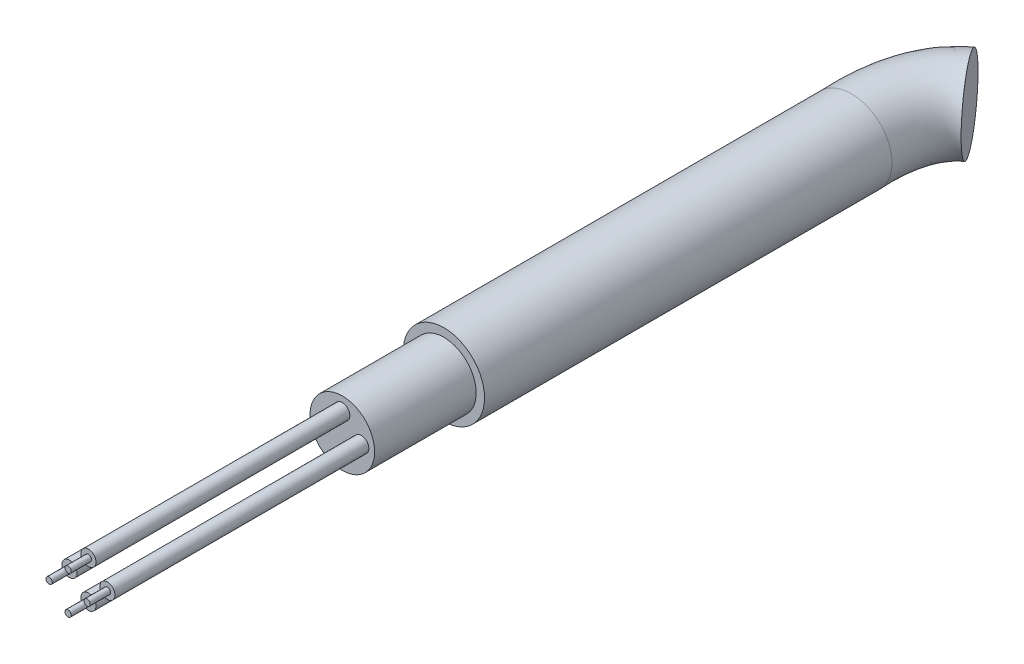
ISO-10303-21;
HEADER;
FILE_DESCRIPTION(('STEP AP214'),'2;1');
FILE_NAME('part.step','',(''),(''),'','','');
FILE_SCHEMA(('AUTOMOTIVE_DESIGN { 1 0 10303 214 1 1 1 1 }'));
ENDSEC;
DATA;
#1=APPLICATION_CONTEXT('core data for automotive mechanical design processes');
#2=APPLICATION_PROTOCOL_DEFINITION('international standard','automotive_design',2000,#1);
#3=PRODUCT_CONTEXT('',#1,'mechanical');
#4=PRODUCT('Part','Part','',(#3));
#5=PRODUCT_RELATED_PRODUCT_CATEGORY('part','',(#4));
#6=PRODUCT_DEFINITION_FORMATION('','',#4);
#7=PRODUCT_DEFINITION_CONTEXT('part definition',#1,'design');
#8=PRODUCT_DEFINITION('design','',#6,#7);
#9=PRODUCT_DEFINITION_SHAPE('','',#8);
#10=(LENGTH_UNIT() NAMED_UNIT(*) SI_UNIT(.MILLI.,.METRE.));
#11=(NAMED_UNIT(*) PLANE_ANGLE_UNIT() SI_UNIT($,.RADIAN.));
#12=(NAMED_UNIT(*) SI_UNIT($,.STERADIAN.) SOLID_ANGLE_UNIT());
#13=UNCERTAINTY_MEASURE_WITH_UNIT(LENGTH_MEASURE(1.E-05),#10,'distance_accuracy_value','');
#14=(GEOMETRIC_REPRESENTATION_CONTEXT(3) GLOBAL_UNCERTAINTY_ASSIGNED_CONTEXT((#13)) GLOBAL_UNIT_ASSIGNED_CONTEXT((#10,
#11,#12)) REPRESENTATION_CONTEXT('',''));
#15=CARTESIAN_POINT('',(0.,0.,0.));
#16=DIRECTION('',(0.,0.,1.));
#17=DIRECTION('',(1.,0.,0.));
#18=AXIS2_PLACEMENT_3D('',#15,#16,#17);
#19=CARTESIAN_POINT('',(0.,0.,0.));
#20=DIRECTION('',(0.,0.,1.));
#21=DIRECTION('',(1.,0.,0.));
#22=AXIS2_PLACEMENT_3D('',#19,#20,#21);
#23=PLANE('',#22);
#24=CARTESIAN_POINT('',(0.,1.86896236105194,0.));
#25=DIRECTION('',(0.,0.,1.));
#26=DIRECTION('',(1.,0.,0.));
#27=AXIS2_PLACEMENT_3D('',#24,#25,#26);
#28=CIRCLE('',#27,0.745292526683294);
#29=CARTESIAN_POINT('',(0.745292526683294,1.86896236105194,0.));
#30=VERTEX_POINT('',#29);
#31=EDGE_CURVE('E74',#30,#30,#28,.T.);
#32=ORIENTED_EDGE('',*,*,#31,.F.);
#33=EDGE_LOOP('',(#32));
#34=FACE_BOUND('',#33,.T.);
#35=CARTESIAN_POINT('',(1.86896236105199,0.,0.));
#36=DIRECTION('',(0.,0.,1.));
#37=DIRECTION('',(1.,0.,0.));
#38=AXIS2_PLACEMENT_3D('',#35,#36,#37);
#39=CIRCLE('',#38,0.745292526683335);
#40=CARTESIAN_POINT('',(2.61425488773533,0.,0.));
#41=VERTEX_POINT('',#40);
#42=EDGE_CURVE('E114',#41,#41,#39,.T.);
#43=ORIENTED_EDGE('',*,*,#42,.F.);
#44=EDGE_LOOP('',(#43));
#45=FACE_BOUND('',#44,.T.);
#46=CARTESIAN_POINT('',(1.05551564692403E-13,-1.86896236105194,0.));
#47=DIRECTION('',(0.,0.,1.));
#48=DIRECTION('',(1.,0.,0.));
#49=AXIS2_PLACEMENT_3D('',#46,#47,#48);
#50=CIRCLE('',#49,0.745292526683408);
#51=CARTESIAN_POINT('',(0.745292526683513,-1.86896236105194,0.));
#52=VERTEX_POINT('',#51);
#53=EDGE_CURVE('E118',#52,#52,#50,.T.);
#54=ORIENTED_EDGE('',*,*,#53,.F.);
#55=EDGE_LOOP('',(#54));
#56=FACE_BOUND('',#55,.T.);
#57=CARTESIAN_POINT('',(-1.86896236105189,0.,0.));
#58=DIRECTION('',(0.,0.,1.));
#59=DIRECTION('',(1.,0.,0.));
#60=AXIS2_PLACEMENT_3D('',#57,#58,#59);
#61=CIRCLE('',#60,0.745292526683379);
#62=CARTESIAN_POINT('',(-1.12366983436851,0.,0.));
#63=VERTEX_POINT('',#62);
#64=EDGE_CURVE('E122',#63,#63,#61,.T.);
#65=ORIENTED_EDGE('',*,*,#64,.F.);
#66=EDGE_LOOP('',(#65));
#67=FACE_BOUND('',#66,.T.);
#68=CARTESIAN_POINT('',(0.,0.,0.));
#69=DIRECTION('',(0.,0.,1.));
#70=DIRECTION('',(1.,0.,0.));
#71=AXIS2_PLACEMENT_3D('',#68,#69,#70);
#72=CIRCLE('',#71,3.17823133983708);
#73=CARTESIAN_POINT('',(3.17823133983708,0.,0.));
#74=VERTEX_POINT('',#73);
#75=EDGE_CURVE('E125',#74,#74,#72,.T.);
#76=ORIENTED_EDGE('',*,*,#75,.T.);
#77=EDGE_LOOP('',(#76));
#78=FACE_BOUND('',#77,.T.);
#79=ADVANCED_FACE('F36',(#34,#45,#56,#67,#78),#23,.T.);
#80=CARTESIAN_POINT('',(0.,1.86896236105194,25.));
#81=DIRECTION('',(0.,0.,-1.));
#82=DIRECTION('',(-1.,0.,0.));
#83=AXIS2_PLACEMENT_3D('',#80,#81,#82);
#84=CYLINDRICAL_SURFACE('',#83,0.745292526683294);
#85=CARTESIAN_POINT('',(0.,1.86896236105194,25.));
#86=DIRECTION('',(0.,0.,1.));
#87=DIRECTION('',(1.,0.,0.));
#88=AXIS2_PLACEMENT_3D('',#85,#86,#87);
#89=CIRCLE('',#88,0.745292526683294);
#90=CARTESIAN_POINT('',(0.745292526683294,1.86896236105194,25.));
#91=VERTEX_POINT('',#90);
#92=EDGE_CURVE('E159',#91,#91,#89,.T.);
#93=ORIENTED_EDGE('',*,*,#92,.F.);
#94=EDGE_LOOP('',(#93));
#95=FACE_BOUND('',#94,.T.);
#96=ORIENTED_EDGE('',*,*,#31,.T.);
#97=EDGE_LOOP('',(#96));
#98=FACE_BOUND('',#97,.T.);
#99=ADVANCED_FACE('F101',(#95,#98),#84,.T.);
#100=CARTESIAN_POINT('',(0.,1.86896236105194,25.));
#101=DIRECTION('',(0.,0.,1.));
#102=DIRECTION('',(1.,0.,0.));
#103=AXIS2_PLACEMENT_3D('',#100,#101,#102);
#104=PLANE('',#103);
#105=CARTESIAN_POINT('',(0.,1.86896236105194,25.));
#106=DIRECTION('',(0.,0.,1.));
#107=DIRECTION('',(1.,0.,0.));
#108=AXIS2_PLACEMENT_3D('',#105,#106,#107);
#109=CIRCLE('',#108,0.309058366374965);
#110=CARTESIAN_POINT('',(0.309058366374965,1.86896236105194,25.));
#111=VERTEX_POINT('',#110);
#112=EDGE_CURVE('E62',#111,#111,#109,.T.);
#113=ORIENTED_EDGE('',*,*,#112,.F.);
#114=EDGE_LOOP('',(#113));
#115=FACE_BOUND('',#114,.T.);
#116=ORIENTED_EDGE('',*,*,#92,.T.);
#117=EDGE_LOOP('',(#116));
#118=FACE_BOUND('',#117,.T.);
#119=ADVANCED_FACE('F106',(#115,#118),#104,.T.);
#120=CARTESIAN_POINT('',(1.86896236105199,0.,25.));
#121=DIRECTION('',(0.,0.,-1.));
#122=DIRECTION('',(-1.,0.,0.));
#123=AXIS2_PLACEMENT_3D('',#120,#121,#122);
#124=CYLINDRICAL_SURFACE('',#123,0.745292526683335);
#125=CARTESIAN_POINT('',(1.86896236105199,0.,25.));
#126=DIRECTION('',(0.,0.,1.));
#127=DIRECTION('',(1.,0.,0.));
#128=AXIS2_PLACEMENT_3D('',#125,#126,#127);
#129=CIRCLE('',#128,0.745292526683335);
#130=CARTESIAN_POINT('',(2.61425488773533,0.,25.));
#131=VERTEX_POINT('',#130);
#132=EDGE_CURVE('E156',#131,#131,#129,.T.);
#133=ORIENTED_EDGE('',*,*,#132,.F.);
#134=EDGE_LOOP('',(#133));
#135=FACE_BOUND('',#134,.T.);
#136=ORIENTED_EDGE('',*,*,#42,.T.);
#137=EDGE_LOOP('',(#136));
#138=FACE_BOUND('',#137,.T.);
#139=ADVANCED_FACE('F232',(#135,#138),#124,.T.);
#140=CARTESIAN_POINT('',(1.86896236105199,0.,25.));
#141=DIRECTION('',(0.,0.,1.));
#142=DIRECTION('',(1.,0.,0.));
#143=AXIS2_PLACEMENT_3D('',#140,#141,#142);
#144=PLANE('',#143);
#145=CARTESIAN_POINT('',(1.86896236105199,0.,25.));
#146=DIRECTION('',(0.,0.,1.));
#147=DIRECTION('',(1.,0.,0.));
#148=AXIS2_PLACEMENT_3D('',#145,#146,#147);
#149=CIRCLE('',#148,0.309058366375007);
#150=CARTESIAN_POINT('',(2.178020727427,0.,25.));
#151=VERTEX_POINT('',#150);
#152=EDGE_CURVE('E65',#151,#151,#149,.T.);
#153=ORIENTED_EDGE('',*,*,#152,.F.);
#154=EDGE_LOOP('',(#153));
#155=FACE_BOUND('',#154,.T.);
#156=ORIENTED_EDGE('',*,*,#132,.T.);
#157=EDGE_LOOP('',(#156));
#158=FACE_BOUND('',#157,.T.);
#159=ADVANCED_FACE('F228',(#155,#158),#144,.T.);
#160=CARTESIAN_POINT('',(1.05551564692403E-13,-1.86896236105194,25.));
#161=DIRECTION('',(0.,0.,-1.));
#162=DIRECTION('',(-1.,0.,0.));
#163=AXIS2_PLACEMENT_3D('',#160,#161,#162);
#164=CYLINDRICAL_SURFACE('',#163,0.745292526683408);
#165=CARTESIAN_POINT('',(1.05551564692403E-13,-1.86896236105194,25.));
#166=DIRECTION('',(0.,0.,1.));
#167=DIRECTION('',(1.,0.,0.));
#168=AXIS2_PLACEMENT_3D('',#165,#166,#167);
#169=CIRCLE('',#168,0.745292526683408);
#170=CARTESIAN_POINT('',(0.745292526683513,-1.86896236105194,25.));
#171=VERTEX_POINT('',#170);
#172=EDGE_CURVE('E152',#171,#171,#169,.T.);
#173=ORIENTED_EDGE('',*,*,#172,.F.);
#174=EDGE_LOOP('',(#173));
#175=FACE_BOUND('',#174,.T.);
#176=ORIENTED_EDGE('',*,*,#53,.T.);
#177=EDGE_LOOP('',(#176));
#178=FACE_BOUND('',#177,.T.);
#179=ADVANCED_FACE('F224',(#175,#178),#164,.T.);
#180=CARTESIAN_POINT('',(1.05551564692403E-13,-1.86896236105194,25.));
#181=DIRECTION('',(0.,0.,1.));
#182=DIRECTION('',(1.,0.,0.));
#183=AXIS2_PLACEMENT_3D('',#180,#181,#182);
#184=PLANE('',#183);
#185=CARTESIAN_POINT('',(1.05551564692403E-13,-1.86896236105194,25.));
#186=DIRECTION('',(0.,0.,1.));
#187=DIRECTION('',(1.,0.,0.));
#188=AXIS2_PLACEMENT_3D('',#185,#186,#187);
#189=CIRCLE('',#188,0.309058366375079);
#190=CARTESIAN_POINT('',(0.309058366375184,-1.86896236105194,25.));
#191=VERTEX_POINT('',#190);
#192=EDGE_CURVE('E45',#191,#191,#189,.T.);
#193=ORIENTED_EDGE('',*,*,#192,.F.);
#194=EDGE_LOOP('',(#193));
#195=FACE_BOUND('',#194,.T.);
#196=ORIENTED_EDGE('',*,*,#172,.T.);
#197=EDGE_LOOP('',(#196));
#198=FACE_BOUND('',#197,.T.);
#199=ADVANCED_FACE('F220',(#195,#198),#184,.T.);
#200=CARTESIAN_POINT('',(-1.86896236105189,0.,25.));
#201=DIRECTION('',(0.,0.,-1.));
#202=DIRECTION('',(-1.,0.,0.));
#203=AXIS2_PLACEMENT_3D('',#200,#201,#202);
#204=CYLINDRICAL_SURFACE('',#203,0.745292526683379);
#205=CARTESIAN_POINT('',(-1.86896236105189,0.,25.));
#206=DIRECTION('',(0.,0.,1.));
#207=DIRECTION('',(1.,0.,0.));
#208=AXIS2_PLACEMENT_3D('',#205,#206,#207);
#209=CIRCLE('',#208,0.745292526683379);
#210=CARTESIAN_POINT('',(-1.12366983436851,0.,25.));
#211=VERTEX_POINT('',#210);
#212=EDGE_CURVE('E148',#211,#211,#209,.T.);
#213=ORIENTED_EDGE('',*,*,#212,.F.);
#214=EDGE_LOOP('',(#213));
#215=FACE_BOUND('',#214,.T.);
#216=ORIENTED_EDGE('',*,*,#64,.T.);
#217=EDGE_LOOP('',(#216));
#218=FACE_BOUND('',#217,.T.);
#219=ADVANCED_FACE('F216',(#215,#218),#204,.T.);
#220=CARTESIAN_POINT('',(-1.86896236105189,0.,25.));
#221=DIRECTION('',(0.,0.,1.));
#222=DIRECTION('',(1.,0.,0.));
#223=AXIS2_PLACEMENT_3D('',#220,#221,#222);
#224=PLANE('',#223);
#225=CARTESIAN_POINT('',(-1.86896236105189,0.,25.));
#226=DIRECTION('',(0.,0.,1.));
#227=DIRECTION('',(1.,0.,0.));
#228=AXIS2_PLACEMENT_3D('',#225,#226,#227);
#229=CIRCLE('',#228,0.30905836637505);
#230=CARTESIAN_POINT('',(-1.55990399467684,0.,25.));
#231=VERTEX_POINT('',#230);
#232=EDGE_CURVE('E12',#231,#231,#229,.T.);
#233=ORIENTED_EDGE('',*,*,#232,.F.);
#234=EDGE_LOOP('',(#233));
#235=FACE_BOUND('',#234,.T.);
#236=ORIENTED_EDGE('',*,*,#212,.T.);
#237=EDGE_LOOP('',(#236));
#238=FACE_BOUND('',#237,.T.);
#239=ADVANCED_FACE('F212',(#235,#238),#224,.T.);
#240=CARTESIAN_POINT('',(0.,1.86896236105194,27.));
#241=DIRECTION('',(0.,0.,-1.));
#242=DIRECTION('',(-1.,0.,0.));
#243=AXIS2_PLACEMENT_3D('',#240,#241,#242);
#244=CYLINDRICAL_SURFACE('',#243,0.309058366374965);
#245=CARTESIAN_POINT('',(0.,1.86896236105194,27.));
#246=DIRECTION('',(0.,0.,1.));
#247=DIRECTION('',(1.,0.,0.));
#248=AXIS2_PLACEMENT_3D('',#245,#246,#247);
#249=CIRCLE('',#248,0.309058366374965);
#250=CARTESIAN_POINT('',(0.309058366374965,1.86896236105194,27.));
#251=VERTEX_POINT('',#250);
#252=EDGE_CURVE('E143',#251,#251,#249,.T.);
#253=ORIENTED_EDGE('',*,*,#252,.F.);
#254=EDGE_LOOP('',(#253));
#255=FACE_BOUND('',#254,.T.);
#256=ORIENTED_EDGE('',*,*,#112,.T.);
#257=EDGE_LOOP('',(#256));
#258=FACE_BOUND('',#257,.T.);
#259=ADVANCED_FACE('F208',(#255,#258),#244,.T.);
#260=CARTESIAN_POINT('',(0.,1.86896236105194,27.));
#261=DIRECTION('',(0.,0.,1.));
#262=DIRECTION('',(1.,0.,0.));
#263=AXIS2_PLACEMENT_3D('',#260,#261,#262);
#264=PLANE('',#263);
#265=ORIENTED_EDGE('',*,*,#252,.T.);
#266=EDGE_LOOP('',(#265));
#267=FACE_BOUND('',#266,.T.);
#268=ADVANCED_FACE('F204',(#267),#264,.T.);
#269=CARTESIAN_POINT('',(1.86896236105199,0.,27.));
#270=DIRECTION('',(0.,0.,-1.));
#271=DIRECTION('',(-1.,0.,0.));
#272=AXIS2_PLACEMENT_3D('',#269,#270,#271);
#273=CYLINDRICAL_SURFACE('',#272,0.309058366375007);
#274=CARTESIAN_POINT('',(1.86896236105199,0.,27.));
#275=DIRECTION('',(0.,0.,1.));
#276=DIRECTION('',(1.,0.,0.));
#277=AXIS2_PLACEMENT_3D('',#274,#275,#276);
#278=CIRCLE('',#277,0.309058366375007);
#279=CARTESIAN_POINT('',(2.178020727427,0.,27.));
#280=VERTEX_POINT('',#279);
#281=EDGE_CURVE('E138',#280,#280,#278,.T.);
#282=ORIENTED_EDGE('',*,*,#281,.F.);
#283=EDGE_LOOP('',(#282));
#284=FACE_BOUND('',#283,.T.);
#285=ORIENTED_EDGE('',*,*,#152,.T.);
#286=EDGE_LOOP('',(#285));
#287=FACE_BOUND('',#286,.T.);
#288=ADVANCED_FACE('F200',(#284,#287),#273,.T.);
#289=CARTESIAN_POINT('',(1.86896236105199,0.,27.));
#290=DIRECTION('',(0.,0.,1.));
#291=DIRECTION('',(1.,0.,0.));
#292=AXIS2_PLACEMENT_3D('',#289,#290,#291);
#293=PLANE('',#292);
#294=ORIENTED_EDGE('',*,*,#281,.T.);
#295=EDGE_LOOP('',(#294));
#296=FACE_BOUND('',#295,.T.);
#297=ADVANCED_FACE('F196',(#296),#293,.T.);
#298=CARTESIAN_POINT('',(1.05551564692403E-13,-1.86896236105194,27.));
#299=DIRECTION('',(0.,0.,-1.));
#300=DIRECTION('',(-1.,0.,0.));
#301=AXIS2_PLACEMENT_3D('',#298,#299,#300);
#302=CYLINDRICAL_SURFACE('',#301,0.309058366375079);
#303=CARTESIAN_POINT('',(1.05551564692403E-13,-1.86896236105194,27.));
#304=DIRECTION('',(0.,0.,1.));
#305=DIRECTION('',(1.,0.,0.));
#306=AXIS2_PLACEMENT_3D('',#303,#304,#305);
#307=CIRCLE('',#306,0.309058366375079);
#308=CARTESIAN_POINT('',(0.309058366375184,-1.86896236105194,27.));
#309=VERTEX_POINT('',#308);
#310=EDGE_CURVE('E134',#309,#309,#307,.T.);
#311=ORIENTED_EDGE('',*,*,#310,.F.);
#312=EDGE_LOOP('',(#311));
#313=FACE_BOUND('',#312,.T.);
#314=ORIENTED_EDGE('',*,*,#192,.T.);
#315=EDGE_LOOP('',(#314));
#316=FACE_BOUND('',#315,.T.);
#317=ADVANCED_FACE('F192',(#313,#316),#302,.T.);
#318=CARTESIAN_POINT('',(1.05551564692403E-13,-1.86896236105194,27.));
#319=DIRECTION('',(0.,0.,1.));
#320=DIRECTION('',(1.,0.,0.));
#321=AXIS2_PLACEMENT_3D('',#318,#319,#320);
#322=PLANE('',#321);
#323=ORIENTED_EDGE('',*,*,#310,.T.);
#324=EDGE_LOOP('',(#323));
#325=FACE_BOUND('',#324,.T.);
#326=ADVANCED_FACE('F188',(#325),#322,.T.);
#327=CARTESIAN_POINT('',(-1.86896236105189,0.,27.));
#328=DIRECTION('',(0.,0.,-1.));
#329=DIRECTION('',(-1.,0.,0.));
#330=AXIS2_PLACEMENT_3D('',#327,#328,#329);
#331=CYLINDRICAL_SURFACE('',#330,0.30905836637505);
#332=CARTESIAN_POINT('',(-1.86896236105189,0.,27.));
#333=DIRECTION('',(0.,0.,1.));
#334=DIRECTION('',(1.,0.,0.));
#335=AXIS2_PLACEMENT_3D('',#332,#333,#334);
#336=CIRCLE('',#335,0.30905836637505);
#337=CARTESIAN_POINT('',(-1.55990399467684,0.,27.));
#338=VERTEX_POINT('',#337);
#339=EDGE_CURVE('E132',#338,#338,#336,.T.);
#340=ORIENTED_EDGE('',*,*,#339,.F.);
#341=EDGE_LOOP('',(#340));
#342=FACE_BOUND('',#341,.T.);
#343=ORIENTED_EDGE('',*,*,#232,.T.);
#344=EDGE_LOOP('',(#343));
#345=FACE_BOUND('',#344,.T.);
#346=ADVANCED_FACE('F184',(#342,#345),#331,.T.);
#347=CARTESIAN_POINT('',(-1.86896236105189,0.,27.));
#348=DIRECTION('',(0.,0.,1.));
#349=DIRECTION('',(1.,0.,0.));
#350=AXIS2_PLACEMENT_3D('',#347,#348,#349);
#351=PLANE('',#350);
#352=ORIENTED_EDGE('',*,*,#339,.T.);
#353=EDGE_LOOP('',(#352));
#354=FACE_BOUND('',#353,.T.);
#355=ADVANCED_FACE('F178',(#354),#351,.T.);
#356=CARTESIAN_POINT('',(0.585566423483881,0.,-10.));
#357=DIRECTION('',(0.,0.,1.));
#358=DIRECTION('',(1.,0.,0.));
#359=AXIS2_PLACEMENT_3D('',#356,#357,#358);
#360=PLANE('',#359);
#361=CARTESIAN_POINT('',(0.,0.,-10.));
#362=DIRECTION('',(0.,0.,1.));
#363=DIRECTION('',(1.,0.,0.));
#364=AXIS2_PLACEMENT_3D('',#361,#362,#363);
#365=CIRCLE('',#364,3.17823133983708);
#366=CARTESIAN_POINT('',(3.17823133983708,0.,-10.));
#367=VERTEX_POINT('',#366);
#368=EDGE_CURVE('E127',#367,#367,#365,.T.);
#369=ORIENTED_EDGE('',*,*,#368,.F.);
#370=EDGE_LOOP('',(#369));
#371=FACE_BOUND('',#370,.T.);
#372=CARTESIAN_POINT('',(0.,0.,-10.));
#373=DIRECTION('',(0.,0.,1.));
#374=DIRECTION('',(1.,0.,0.));
#375=AXIS2_PLACEMENT_3D('',#372,#373,#374);
#376=CIRCLE('',#375,4.);
#377=CARTESIAN_POINT('',(4.,0.,-10.));
#378=VERTEX_POINT('',#377);
#379=EDGE_CURVE('E40',#378,#378,#376,.T.);
#380=ORIENTED_EDGE('',*,*,#379,.T.);
#381=EDGE_LOOP('',(#380));
#382=FACE_BOUND('',#381,.T.);
#383=ADVANCED_FACE('F172',(#371,#382),#360,.T.);
#384=CARTESIAN_POINT('',(0.,0.,-10.));
#385=DIRECTION('',(0.,0.,1.));
#386=DIRECTION('',(1.,0.,0.));
#387=AXIS2_PLACEMENT_3D('',#384,#385,#386);
#388=CYLINDRICAL_SURFACE('',#387,3.17823133983708);
#389=ORIENTED_EDGE('',*,*,#368,.T.);
#390=EDGE_LOOP('',(#389));
#391=FACE_BOUND('',#390,.T.);
#392=ORIENTED_EDGE('',*,*,#75,.F.);
#393=EDGE_LOOP('',(#392));
#394=FACE_BOUND('',#393,.T.);
#395=ADVANCED_FACE('F168',(#391,#394),#388,.T.);
#396=CARTESIAN_POINT('',(2.8340954734297,0.,-58.922304352964));
#397=DIRECTION('',(-0.803450903354103,0.,0.595371015333696));
#398=DIRECTION('',(0.595371015333696,0.,0.803450903354103));
#399=AXIS2_PLACEMENT_3D('',#396,#397,#398);
#400=PLANE('',#399);
#401=CARTESIAN_POINT('',(2.8340954734297,0.,-58.922304352964));
#402=DIRECTION('',(-0.803450903354103,0.,0.595371015333696));
#403=DIRECTION('',(0.595371015333696,0.,0.803450903354103));
#404=AXIS2_PLACEMENT_3D('',#401,#402,#403);
#405=CIRCLE('',#404,4.);
#406=CARTESIAN_POINT('',(5.21557953476449,0.,-55.7085007395476));
#407=VERTEX_POINT('',#406);
#408=EDGE_CURVE('E58',#407,#407,#405,.T.);
#409=ORIENTED_EDGE('',*,*,#408,.F.);
#410=EDGE_LOOP('',(#409));
#411=FACE_BOUND('',#410,.T.);
#412=ADVANCED_FACE('F38',(#411),#400,.F.);
#413=CARTESIAN_POINT('',(4.00672619687716,0.,-50.0083802094525));
#414=CARTESIAN_POINT('',(4.00207838189957,0.,-50.0856464339236));
#415=CARTESIAN_POINT('',(3.99706454064748,0.,-50.1689868795729));
#416=CARTESIAN_POINT('',(3.9777024969775,0.,-50.4909137125681));
#417=CARTESIAN_POINT('',(3.96932640783645,0.,-50.6916710846166));
#418=CARTESIAN_POINT('',(3.95791583194575,0.,-51.1212011860934));
#419=CARTESIAN_POINT('',(3.95616590553623,0.,-51.3285891028583));
#420=CARTESIAN_POINT('',(3.9621090793307,0.,-51.9281191479228));
#421=CARTESIAN_POINT('',(3.98105355248449,0.,-52.2976014010061));
#422=CARTESIAN_POINT('',(4.07556151478469,0.,-53.3119250515326));
#423=CARTESIAN_POINT('',(4.18961013673211,0.,-53.8608560669799));
#424=CARTESIAN_POINT('',(4.45916773460456,0.,-54.7094777860373));
#425=CARTESIAN_POINT('',(4.61139176730067,0.,-55.0074491485355));
#426=CARTESIAN_POINT('',(4.90473740837825,0.,-55.4402902188833));
#427=CARTESIAN_POINT('',(5.04325241417801,0.,-55.580803360092));
#428=CARTESIAN_POINT('',(5.21557953476449,0.,-55.7085007395476));
#429=CARTESIAN_POINT('',(4.00672619687716,8.,-50.0083802094525));
#430=CARTESIAN_POINT('',(4.00207838189957,8.,-50.0856464339236));
#431=CARTESIAN_POINT('',(3.99706454064748,8.,-50.1689868795729));
#432=CARTESIAN_POINT('',(3.9777024969775,8.,-50.4909137125681));
#433=CARTESIAN_POINT('',(3.96932640783645,8.,-50.6916710846166));
#434=CARTESIAN_POINT('',(3.95791583194575,8.,-51.1212011860934));
#435=CARTESIAN_POINT('',(3.95616590553623,8.,-51.3285891028583));
#436=CARTESIAN_POINT('',(3.9621090793307,8.,-51.9281191479228));
#437=CARTESIAN_POINT('',(3.98105355248449,8.,-52.2976014010061));
#438=CARTESIAN_POINT('',(4.07556151478469,8.,-53.3119250515326));
#439=CARTESIAN_POINT('',(4.18961013673211,8.,-53.8608560669799));
#440=CARTESIAN_POINT('',(4.45916773460456,8.,-54.7094777860373));
#441=CARTESIAN_POINT('',(4.61139176730067,8.,-55.0074491485355));
#442=CARTESIAN_POINT('',(4.90473740837825,8.,-55.4402902188833));
#443=CARTESIAN_POINT('',(5.04325241417801,8.,-55.580803360092));
#444=CARTESIAN_POINT('',(5.21557953476449,8.,-55.7085007395476));
#445=CARTESIAN_POINT('',(-3.97883930701196,8.,-49.5280224437235));
#446=CARTESIAN_POINT('',(-3.98348712198954,8.,-49.6052886681946));
#447=CARTESIAN_POINT('',(-3.9877705469975,8.,-49.6764825428556));
#448=CARTESIAN_POINT('',(-4.0104354979797,8.,-50.0533355887569));
#449=CARTESIAN_POINT('',(-4.02537730610587,8.,-50.3860598741112));
#450=CARTESIAN_POINT('',(-4.04173773935027,8.,-51.0019182543195));
#451=CARTESIAN_POINT('',(-4.04444668779672,8.,-51.3064437527262));
#452=CARTESIAN_POINT('',(-4.03548659702524,8.,-52.2103114761502));
#453=CARTESIAN_POINT('',(-4.00678904162212,8.,-52.7999710993499));
#454=CARTESIAN_POINT('',(-3.84525136171539,8.,-54.5337031695196));
#455=CARTESIAN_POINT('',(-3.63777681347431,8.,-55.6443160904133));
#456=CARTESIAN_POINT('',(-2.96263592020341,8.,-57.7697958223358));
#457=CARTESIAN_POINT('',(-2.49168463194451,8.,-58.7863819745058));
#458=CARTESIAN_POINT('',(-1.23702748034564,8.,-60.6376695118462));
#459=CARTESIAN_POINT('',(-0.450715014423362,8.,-61.4667274636364));
#460=CARTESIAN_POINT('',(0.452611412094917,8.,-62.1361079663804));
#461=CARTESIAN_POINT('',(-3.97883930701196,0.,-49.5280224437235));
#462=CARTESIAN_POINT('',(-3.98348712198954,0.,-49.6052886681946));
#463=CARTESIAN_POINT('',(-3.9877705469975,0.,-49.6764825428556));
#464=CARTESIAN_POINT('',(-4.0104354979797,0.,-50.0533355887569));
#465=CARTESIAN_POINT('',(-4.02537730610587,0.,-50.3860598741112));
#466=CARTESIAN_POINT('',(-4.04173773935027,0.,-51.0019182543195));
#467=CARTESIAN_POINT('',(-4.04444668779673,0.,-51.3064437527262));
#468=CARTESIAN_POINT('',(-4.03548659702524,0.,-52.2103114761502));
#469=CARTESIAN_POINT('',(-4.00678904162213,0.,-52.7999710993499));
#470=CARTESIAN_POINT('',(-3.84525136171539,0.,-54.5337031695196));
#471=CARTESIAN_POINT('',(-3.63777681347431,0.,-55.6443160904133));
#472=CARTESIAN_POINT('',(-2.96263592020341,0.,-57.7697958223358));
#473=CARTESIAN_POINT('',(-2.49168463194451,0.,-58.7863819745058));
#474=CARTESIAN_POINT('',(-1.23702748034564,0.,-60.6376695118462));
#475=CARTESIAN_POINT('',(-0.450715014423145,0.,-61.4667274636364));
#476=CARTESIAN_POINT('',(0.452611412094917,0.,-62.1361079663804));
#477=CARTESIAN_POINT('',(-3.97883930701196,-8.,-49.5280224437235));
#478=CARTESIAN_POINT('',(-3.98348712198954,-8.,-49.6052886681946));
#479=CARTESIAN_POINT('',(-3.9877705469975,-8.,-49.6764825428556));
#480=CARTESIAN_POINT('',(-4.0104354979797,-8.,-50.0533355887569));
#481=CARTESIAN_POINT('',(-4.02537730610587,-8.,-50.3860598741112));
#482=CARTESIAN_POINT('',(-4.04173773935027,-8.,-51.0019182543195));
#483=CARTESIAN_POINT('',(-4.04444668779673,-8.,-51.3064437527262));
#484=CARTESIAN_POINT('',(-4.03548659702524,-8.,-52.2103114761502));
#485=CARTESIAN_POINT('',(-4.00678904162213,-8.,-52.7999710993499));
#486=CARTESIAN_POINT('',(-3.84525136171539,-8.,-54.5337031695196));
#487=CARTESIAN_POINT('',(-3.63777681347432,-8.,-55.6443160904133));
#488=CARTESIAN_POINT('',(-2.96263592020341,-8.,-57.7697958223358));
#489=CARTESIAN_POINT('',(-2.49168463194451,-8.,-58.7863819745058));
#490=CARTESIAN_POINT('',(-1.23702748034564,-8.,-60.6376695118462));
#491=CARTESIAN_POINT('',(-0.450715014422928,-8.,-61.4667274636364));
#492=CARTESIAN_POINT('',(0.452611412094916,-8.,-62.1361079663804));
#493=CARTESIAN_POINT('',(4.00672619687716,-8.,-50.0083802094525));
#494=CARTESIAN_POINT('',(4.00207838189957,-8.,-50.0856464339236));
#495=CARTESIAN_POINT('',(3.99706454064748,-8.,-50.1689868795729));
#496=CARTESIAN_POINT('',(3.9777024969775,-8.,-50.4909137125681));
#497=CARTESIAN_POINT('',(3.96932640783645,-8.,-50.6916710846166));
#498=CARTESIAN_POINT('',(3.95791583194575,-8.,-51.1212011860934));
#499=CARTESIAN_POINT('',(3.95616590553623,-8.,-51.3285891028583));
#500=CARTESIAN_POINT('',(3.9621090793307,-8.,-51.9281191479228));
#501=CARTESIAN_POINT('',(3.98105355248449,-8.,-52.2976014010061));
#502=CARTESIAN_POINT('',(4.07556151478469,-8.,-53.3119250515326));
#503=CARTESIAN_POINT('',(4.18961013673211,-8.,-53.8608560669799));
#504=CARTESIAN_POINT('',(4.45916773460456,-8.,-54.7094777860373));
#505=CARTESIAN_POINT('',(4.61139176730067,-8.,-55.0074491485355));
#506=CARTESIAN_POINT('',(4.90473740837825,-8.,-55.4402902188833));
#507=CARTESIAN_POINT('',(5.04325241417801,-8.,-55.580803360092));
#508=CARTESIAN_POINT('',(5.21557953476449,-8.,-55.7085007395476));
#509=CARTESIAN_POINT('',(4.00672619687716,0.,-50.0083802094525));
#510=CARTESIAN_POINT('',(4.00207838189957,0.,-50.0856464339236));
#511=CARTESIAN_POINT('',(3.99706454064748,0.,-50.1689868795729));
#512=CARTESIAN_POINT('',(3.9777024969775,0.,-50.4909137125681));
#513=CARTESIAN_POINT('',(3.96932640783645,0.,-50.6916710846166));
#514=CARTESIAN_POINT('',(3.95791583194575,0.,-51.1212011860934));
#515=CARTESIAN_POINT('',(3.95616590553623,0.,-51.3285891028583));
#516=CARTESIAN_POINT('',(3.9621090793307,0.,-51.9281191479228));
#517=CARTESIAN_POINT('',(3.98105355248449,0.,-52.2976014010061));
#518=CARTESIAN_POINT('',(4.07556151478469,0.,-53.3119250515326));
#519=CARTESIAN_POINT('',(4.18961013673211,0.,-53.8608560669799));
#520=CARTESIAN_POINT('',(4.45916773460456,0.,-54.7094777860373));
#521=CARTESIAN_POINT('',(4.61139176730067,0.,-55.0074491485355));
#522=CARTESIAN_POINT('',(4.90473740837825,0.,-55.4402902188833));
#523=CARTESIAN_POINT('',(5.04325241417801,0.,-55.580803360092));
#524=CARTESIAN_POINT('',(5.21557953476449,0.,-55.7085007395476));
#525=(BOUNDED_SURFACE() B_SPLINE_SURFACE(3,3,((#413,#414,#415,#416,#417,#418,#419,#420,#421,
#422,#423,#424,#425,#426,#427,#428),(#429,#430,#431,#432,#433,#434,#435,#436,#437,#438,#439,
#440,#441,#442,#443,#444),(#445,#446,#447,#448,#449,#450,#451,#452,#453,#454,#455,#456,#457,
#458,#459,#460),(#461,#462,#463,#464,#465,#466,#467,#468,#469,#470,#471,#472,#473,#474,#475,
#476),(#477,#478,#479,#480,#481,#482,#483,#484,#485,#486,#487,#488,#489,#490,#491,#492),(#493,
#494,#495,#496,#497,#498,#499,#500,#501,#502,#503,#504,#505,#506,#507,#508),(#509,#510,#511,
#512,#513,#514,#515,#516,#517,#518,#519,#520,#521,#522,#523,#524)),.UNSPECIFIED.,.T.,.F.,
.F.) B_SPLINE_SURFACE_WITH_KNOTS((4,3,4),(4,2,2,2,2,2,2,4),(0.,0.5,1.),(-0.0177458401410981,0.,
0.0625,0.125,0.25,0.5,0.75,1.),
.UNSPECIFIED.) GEOMETRIC_REPRESENTATION_ITEM() RATIONAL_B_SPLINE_SURFACE(((1.,1.,1.,1.,1.,1.,1.,
1.,1.,1.,1.,1.,1.,1.,1.,1.),(0.333333333333333,0.333333333333333,0.333333333333333,
0.333333333333333,0.333333333333333,0.333333333333333,0.333333333333333,0.333333333333333,
0.333333333333333,0.333333333333333,0.333333333333333,0.333333333333333,0.333333333333333,
0.333333333333333,0.333333333333333,0.333333333333333),(0.333333333333333,0.333333333333333,
0.333333333333333,0.333333333333333,0.333333333333333,0.333333333333333,0.333333333333333,
0.333333333333333,0.333333333333333,0.333333333333333,0.333333333333333,0.333333333333333,
0.333333333333333,0.333333333333333,0.333333333333333,0.333333333333333),(1.,1.,1.,1.,1.,1.,1.,
1.,1.,1.,1.,1.,1.,1.,1.,1.),(0.333333333333333,0.333333333333333,0.333333333333333,
0.333333333333333,0.333333333333333,0.333333333333333,0.333333333333333,0.333333333333333,
0.333333333333333,0.333333333333333,0.333333333333333,0.333333333333333,0.333333333333333,
0.333333333333333,0.333333333333333,0.333333333333333),(0.333333333333333,0.333333333333333,
0.333333333333333,0.333333333333333,0.333333333333333,0.333333333333333,0.333333333333333,
0.333333333333333,0.333333333333333,0.333333333333333,0.333333333333333,0.333333333333333,
0.333333333333333,0.333333333333333,0.333333333333333,0.333333333333333),(1.,1.,1.,1.,1.,1.,1.,
1.,1.,1.,1.,1.,1.,1.,1.,1.))) REPRESENTATION_ITEM('') SURFACE());
#526=CARTESIAN_POINT('',(0.,-4.,-50.));
#527=CARTESIAN_POINT('',(-0.0171997998424996,-4.00000016046357,-49.9994832385518));
#528=CARTESIAN_POINT('',(-0.034400844136553,-3.99988918360831,-49.9989667033206));
#529=CARTESIAN_POINT('',(-0.16388914126829,-3.99821766780464,-49.9950802457596));
#530=CARTESIAN_POINT('',(-0.276160200801189,-3.99203524451447,-49.9917217813082));
#531=CARTESIAN_POINT('',(-0.499812722203374,-3.97024244676974,-49.9850540768173));
#532=CARTESIAN_POINT('',(-0.611193741664172,-3.95462764730748,-49.9817448606287));
#533=CARTESIAN_POINT('',(-0.832492748245821,-3.91402975644806,-49.9751922671484));
#534=CARTESIAN_POINT('',(-0.942407178911246,-3.88902709472763,-49.9719490424187));
#535=CARTESIAN_POINT('',(-1.15979442926671,-3.82982958440634,-49.9655563500875));
#536=CARTESIAN_POINT('',(-1.26726531634964,-3.79562771683614,-49.9624069561253));
#537=CARTESIAN_POINT('',(-1.58434695653262,-3.6797182794343,-49.9531461835285));
#538=CARTESIAN_POINT('',(-1.78922764630992,-3.58459594941063,-49.9472044363475));
#539=CARTESIAN_POINT('',(-2.18009202821372,-3.3612302305065,-49.9359382900171));
#540=CARTESIAN_POINT('',(-2.36607480428265,-3.23298523710411,-49.9306139207926));
#541=CARTESIAN_POINT('',(-2.62679803415673,-3.01871546946381,-49.9231898254224));
#542=CARTESIAN_POINT('',(-2.71070032374641,-2.9435999540102,-49.9208078483413));
#543=CARTESIAN_POINT('',(-2.87182173221029,-2.78662233958251,-49.9162453216258));
#544=CARTESIAN_POINT('',(-2.94904723049032,-2.70476682975934,-49.9140645795823));
#545=CARTESIAN_POINT('',(-3.0963648569286,-2.534793523488,-49.9099141973749));
#546=CARTESIAN_POINT('',(-3.1664534403514,-2.44667265172707,-49.9079446620867));
#547=CARTESIAN_POINT('',(-3.29896420613212,-2.26484246185766,-49.9042287384611));
#548=CARTESIAN_POINT('',(-3.36138460769301,-2.17113185311147,-49.9024824019537));
#549=CARTESIAN_POINT('',(-3.53635369155693,-1.88271803965867,-49.8975960545925));
#550=CARTESIAN_POINT('',(-3.63682745857571,-1.68048176357643,-49.8948026035926));
#551=CARTESIAN_POINT('',(-3.80233495543803,-1.26211276756243,-49.890210996355));
#552=CARTESIAN_POINT('',(-3.86736946064468,-1.04598035177509,-49.8884128183422));
#553=CARTESIAN_POINT('',(-3.9602285870426,-0.605900040178819,-49.8858476750648));
#554=CARTESIAN_POINT('',(-3.98806504823011,-0.381954654507879,-49.8850803816732));
#555=CARTESIAN_POINT('',(-4.00574949324861,0.0674247251940653,-49.8845927571744));
#556=CARTESIAN_POINT('',(-3.99559749225594,0.292858718630337,-49.884872425649));
#557=CARTESIAN_POINT('',(-3.93760518939902,0.738788127017385,-49.886472548316));
#558=CARTESIAN_POINT('',(-3.8897707193213,0.959284300721433,-49.8877928414602));
#559=CARTESIAN_POINT('',(-3.75777872548763,1.38911674876828,-49.8914462345222));
#560=CARTESIAN_POINT('',(-3.67362068883005,1.59845286548022,-49.8937793487413));
#561=CARTESIAN_POINT('',(-3.47136315030364,2.00004764712953,-49.8994087389051));
#562=CARTESIAN_POINT('',(-3.35325955038074,2.19230424648355,-49.9027051311416));
#563=CARTESIAN_POINT('',(-3.08648460297496,2.55424136479484,-49.9101883194604));
#564=CARTESIAN_POINT('',(-2.93781618276256,2.72392404315248,-49.9143750302758));
#565=CARTESIAN_POINT('',(-2.61411735096166,3.03594002104257,-49.9235444733507));
#566=CARTESIAN_POINT('',(-2.43908482085417,3.17827112061317,-49.9285272695824));
#567=CARTESIAN_POINT('',(-2.06753175207335,3.43160081965791,-49.9391740451357));
#568=CARTESIAN_POINT('',(-1.87100049145719,3.54258368525735,-49.9448383644915));
#569=CARTESIAN_POINT('',(-1.46181500717388,3.7301283997984,-49.9567141920449));
#570=CARTESIAN_POINT('',(-1.2491356540932,3.80663525949576,-49.962926555637));
#571=CARTESIAN_POINT('',(-0.814306654249145,3.92267301271335,-49.9757188565253));
#572=CARTESIAN_POINT('',(-0.592178468820724,3.96228346401322,-49.9822979703758));
#573=CARTESIAN_POINT('',(-0.263123063843658,3.99274474333043,-49.9921117648735));
#574=CARTESIAN_POINT('',(-0.157382325998497,3.99830290515929,-49.9952755343278));
#575=CARTESIAN_POINT('',(-0.0344016314612747,3.99988897128241,-49.9989666808305));
#576=CARTESIAN_POINT('',(-0.0172007037148562,3.99999991492534,-49.9994832127307));
#577=CARTESIAN_POINT('',(0.,4.,-50.));
#578=B_SPLINE_CURVE_WITH_KNOTS('',3,(#526,#527,#528,#529,#530,#531,#532,#533,#534,#535,#536,
#537,#538,#539,#540,#541,#542,#543,#544,#545,#546,#547,#548,#549,#550,#551,#552,#553,#554,#555,
#556,#557,#558,#559,#560,#561,#562,#563,#564,#565,#566,#567,#568,#569,#570,#571,#572,#573,#574,
#575,#576,#577),.UNSPECIFIED.,.F.,.F.,(4,2,2,2,2,2,2,2,2,2,2,2,2,2,2,2,2,2,2,2,2,2,2,2,2,4),(0.,
0.051625833154178,0.388644569181992,0.725821533625915,1.06370532908881,1.40184766392189,
2.07632162571496,2.75082826638094,3.08841019971239,3.42566593794721,3.76308837429776,
4.1005890233867,4.77460673899233,5.44860970740979,6.12239809209979,6.79618620761237,
7.46987006730562,8.14356343996507,8.81733817796546,9.49104841688287,10.164812821487,
10.8389147941932,11.5140881868295,12.1878023455605,12.505306139994,12.5569319731482),.UNSPECIFIED.);
#579=CARTESIAN_POINT('',(0.,-4.,-50.));
#580=VERTEX_POINT('',#579);
#581=CARTESIAN_POINT('',(0.,4.,-50.));
#582=VERTEX_POINT('',#581);
#583=EDGE_CURVE('E52',#580,#582,#578,.T.);
#584=CARTESIAN_POINT('',(0.,-4.,-50.));
#585=CARTESIAN_POINT('',(0.0171997999203268,-4.00000016046418,-50.0005167602492));
#586=CARTESIAN_POINT('',(0.0344008362816297,-3.99988918360941,-50.001033558877));
#587=CARTESIAN_POINT('',(0.163892170674326,-3.99821762935347,-50.0049240861737));
#588=CARTESIAN_POINT('',(0.276165943449349,-3.99203491416875,-50.0082973689855));
#589=CARTESIAN_POINT('',(0.499823172944169,-3.97024119895367,-50.0150172815893));
#590=CARTESIAN_POINT('',(0.611206186870388,-3.95462577331229,-50.0183638981229));
#591=CARTESIAN_POINT('',(0.832508518949557,-3.91402645353337,-50.025013240942));
#592=CARTESIAN_POINT('',(0.942424278769902,-3.88902298640371,-50.0283158604982));
#593=CARTESIAN_POINT('',(1.15981357071895,-3.82982382245345,-50.0348477959486));
#594=CARTESIAN_POINT('',(1.26728516989495,-3.79562110707689,-50.0380770538231));
#595=CARTESIAN_POINT('',(1.58437005134042,-3.6797085481409,-50.0476047758691));
#596=CARTESIAN_POINT('',(1.78925241547663,-3.58458372486507,-50.0537611863517));
#597=CARTESIAN_POINT('',(2.18011901458465,-3.36121287814578,-50.065506317432));
#598=CARTESIAN_POINT('',(2.36610233228913,-3.23296524815207,-50.0710950104755));
#599=CARTESIAN_POINT('',(2.62682920152597,-3.01868853326995,-50.078929778961));
#600=CARTESIAN_POINT('',(2.71073448566558,-2.94356869337014,-50.0814511222113));
#601=CARTESIAN_POINT('',(2.87186134874133,-2.7865817225337,-50.086292983181));
#602=CARTESIAN_POINT('',(2.94908930738027,-2.70472118120664,-50.0886136925913));
#603=CARTESIAN_POINT('',(3.09641126317025,-2.5347370783372,-50.0930407483575));
#604=CARTESIAN_POINT('',(3.16650171578572,-2.44661044154319,-50.0951469882061));
#605=CARTESIAN_POINT('',(3.29901553290485,-2.26476798901009,-50.099129078675));
#606=CARTESIAN_POINT('',(3.36143711671508,-2.17105088265328,-50.1010048757871));
#607=CARTESIAN_POINT('',(3.53640480546885,-1.8826226601645,-50.1062627434341));
#608=CARTESIAN_POINT('',(3.63687583443897,-1.68037802029046,-50.109281961056));
#609=CARTESIAN_POINT('',(3.80237578097843,-1.26199099110408,-50.114255345561));
#610=CARTESIAN_POINT('',(3.86740548831604,-1.0458489115999,-50.1162095361768));
#611=CARTESIAN_POINT('',(3.96024902797601,-0.605763877695028,-50.1189995542668));
#612=CARTESIAN_POINT('',(3.98807721251069,-0.381823965901824,-50.119835813035));
#613=CARTESIAN_POINT('',(4.00574713619122,0.0675433873013061,-50.1203668080194));
#614=CARTESIAN_POINT('',(3.99558890041879,0.292970827728947,-50.1200615449893));
#615=CARTESIAN_POINT('',(3.93758768563471,0.73887666964957,-50.118318563849));
#616=CARTESIAN_POINT('',(3.88975205887298,0.959356028063895,-50.1168810666795));
#617=CARTESIAN_POINT('',(3.75776375558093,1.38915453561665,-50.1129147236084));
#618=CARTESIAN_POINT('',(3.6736105748835,1.59847352977947,-50.1103858625562));
#619=CARTESIAN_POINT('',(3.47136687522473,2.00003966853833,-50.1043083186478));
#620=CARTESIAN_POINT('',(3.35327151169824,2.19228437099105,-50.1007594902116));
#621=CARTESIAN_POINT('',(3.08651774611225,2.55420004545534,-50.0927434409119));
#622=CARTESIAN_POINT('',(2.93786220564948,2.72387312858192,-50.0882763060369));
#623=CARTESIAN_POINT('',(2.61410829518696,3.03595530464698,-50.0785475085567));
#624=CARTESIAN_POINT('',(2.43899406746565,3.17834793048209,-50.0732853694746));
#625=CARTESIAN_POINT('',(2.06726000884724,3.43177114573877,-50.0621150035783));
#626=CARTESIAN_POINT('',(1.87062946597982,3.54278601419092,-50.0562064549472));
#627=CARTESIAN_POINT('',(1.46139263375155,3.73028959443694,-50.0439095368195));
#628=CARTESIAN_POINT('',(1.2487733953719,3.80674996199569,-50.0375207784098));
#629=CARTESIAN_POINT('',(0.814071508327115,3.92271777068744,-50.0244592319043));
#630=CARTESIAN_POINT('',(0.592010316781348,3.96230475861763,-50.0177870878451));
#631=CARTESIAN_POINT('',(0.263055703537207,3.99274827047219,-50.0079034698374));
#632=CARTESIAN_POINT('',(0.157348774880348,3.99830333834686,-50.0047274919983));
#633=CARTESIAN_POINT('',(0.0344016237772435,3.99988897130304,-50.0010335825929));
#634=CARTESIAN_POINT('',(0.017200703965496,3.99999991494558,-50.0005167874454));
#635=CARTESIAN_POINT('',(0.,4.,-50.));
#636=B_SPLINE_CURVE_WITH_KNOTS('',3,(#584,#585,#586,#587,#588,#589,#590,#591,#592,#593,#594,
#595,#596,#597,#598,#599,#600,#601,#602,#603,#604,#605,#606,#607,#608,#609,#610,#611,#612,#613,
#614,#615,#616,#617,#618,#619,#620,#621,#622,#623,#624,#625,#626,#627,#628,#629,#630,#631,#632,
#633,#634,#635),.UNSPECIFIED.,.F.,.F.,(4,2,2,2,2,2,2,2,2,2,2,2,2,2,2,2,2,2,2,2,2,2,2,2,2,4),(0.,
0.0516258331462151,0.388654044077501,0.725840503852165,1.06373389796828,1.40188582234895,
2.07638484090952,2.75091658073485,3.08852291622872,3.42580304426497,3.76324985942163,
4.10077488144228,4.7748196481295,5.44884939390575,6.12261902633833,6.79638821389345,
7.4700259567699,8.14367305151291,8.8174163436427,9.49109657644715,10.1651821854947,
10.8396049304873,11.5145798887422,12.18809533062,12.505498788129,12.5571246212753),.UNSPECIFIED.);
#637=EDGE_CURVE('E54',#580,#582,#636,.T.);
#638=ORIENTED_EDGE('',*,*,#583,.T.);
#639=ORIENTED_EDGE('',*,*,#637,.F.);
#640=EDGE_LOOP('',(#638,#639));
#641=FACE_BOUND('',#640,.T.);
#642=ORIENTED_EDGE('',*,*,#408,.T.);
#643=EDGE_LOOP('',(#642));
#644=FACE_BOUND('',#643,.T.);
#645=ADVANCED_FACE('F60',(#641,#644),#525,.F.);
#646=CARTESIAN_POINT('',(0.,0.,0.));
#647=DIRECTION('',(0.,0.,-1.));
#648=DIRECTION('',(-1.,0.,0.));
#649=AXIS2_PLACEMENT_3D('',#646,#647,#648);
#650=CYLINDRICAL_SURFACE('',#649,4.);
#651=ORIENTED_EDGE('',*,*,#637,.T.);
#652=ORIENTED_EDGE('',*,*,#583,.F.);
#653=EDGE_LOOP('',(#651,#652));
#654=FACE_BOUND('',#653,.T.);
#655=ORIENTED_EDGE('',*,*,#379,.F.);
#656=EDGE_LOOP('',(#655));
#657=FACE_BOUND('',#656,.T.);
#658=ADVANCED_FACE('F55',(#654,#657),#650,.T.);
#659=CLOSED_SHELL('',(#79,#99,#119,#139,#159,#179,#199,#219,#239,#259,#268,#288,#297,#317,#326,
#346,#355,#383,#395,#412,#645,#658));
#660=MANIFOLD_SOLID_BREP('B2',#659);
#661=ADVANCED_BREP_SHAPE_REPRESENTATION('',(#18,#660),#14);
#662=SHAPE_DEFINITION_REPRESENTATION(#9,#661);
ENDSEC;
END-ISO-10303-21;
